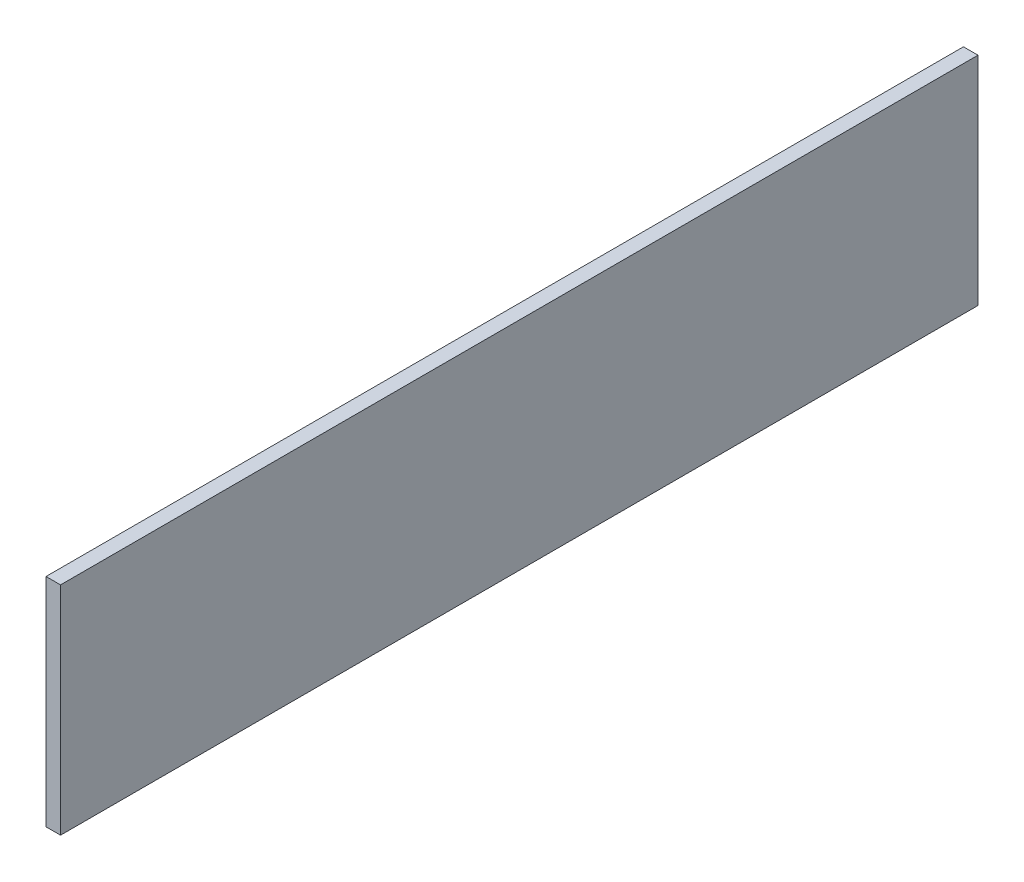
ISO-10303-21;
HEADER;
FILE_DESCRIPTION(('STEP AP214'),'2;1');
FILE_NAME('part.step','',(''),(''),'','','');
FILE_SCHEMA(('AUTOMOTIVE_DESIGN { 1 0 10303 214 1 1 1 1 }'));
ENDSEC;
DATA;
#1=APPLICATION_CONTEXT('core data for automotive mechanical design processes');
#2=APPLICATION_PROTOCOL_DEFINITION('international standard','automotive_design',2000,#1);
#3=PRODUCT_CONTEXT('',#1,'mechanical');
#4=PRODUCT('Part','Part','',(#3));
#5=PRODUCT_RELATED_PRODUCT_CATEGORY('part','',(#4));
#6=PRODUCT_DEFINITION_FORMATION('','',#4);
#7=PRODUCT_DEFINITION_CONTEXT('part definition',#1,'design');
#8=PRODUCT_DEFINITION('design','',#6,#7);
#9=PRODUCT_DEFINITION_SHAPE('','',#8);
#10=(LENGTH_UNIT() NAMED_UNIT(*) SI_UNIT(.MILLI.,.METRE.));
#11=(NAMED_UNIT(*) PLANE_ANGLE_UNIT() SI_UNIT($,.RADIAN.));
#12=(NAMED_UNIT(*) SI_UNIT($,.STERADIAN.) SOLID_ANGLE_UNIT());
#13=UNCERTAINTY_MEASURE_WITH_UNIT(LENGTH_MEASURE(1.E-05),#10,'distance_accuracy_value','');
#14=(GEOMETRIC_REPRESENTATION_CONTEXT(3) GLOBAL_UNCERTAINTY_ASSIGNED_CONTEXT((#13)) GLOBAL_UNIT_ASSIGNED_CONTEXT((#10,
#11,#12)) REPRESENTATION_CONTEXT('',''));
#15=CARTESIAN_POINT('',(0.,0.,0.));
#16=DIRECTION('',(0.,0.,1.));
#17=DIRECTION('',(1.,0.,0.));
#18=AXIS2_PLACEMENT_3D('',#15,#16,#17);
#19=CARTESIAN_POINT('',(1338.,1469.,-757.5));
#20=DIRECTION('',(-1.,0.,0.));
#21=DIRECTION('',(0.,0.,1.));
#22=AXIS2_PLACEMENT_3D('',#19,#20,#21);
#23=PLANE('',#22);
#24=DIRECTION('',(0.,-1.,0.));
#25=VECTOR('',#24,1.);
#26=CARTESIAN_POINT('',(1338.,1469.,0.));
#27=LINE('',#26,#25);
#28=CARTESIAN_POINT('',(1338.,1648.,0.));
#29=VERTEX_POINT('',#28);
#30=CARTESIAN_POINT('',(1338.,1469.,0.));
#31=VERTEX_POINT('',#30);
#32=EDGE_CURVE('E103',#29,#31,#27,.T.);
#33=ORIENTED_EDGE('',*,*,#32,.F.);
#34=DIRECTION('',(0.,0.,1.));
#35=VECTOR('',#34,1.);
#36=CARTESIAN_POINT('',(1338.,1648.,-757.5));
#37=LINE('',#36,#35);
#38=CARTESIAN_POINT('',(1338.,1648.,-757.5));
#39=VERTEX_POINT('',#38);
#40=EDGE_CURVE('E11',#39,#29,#37,.T.);
#41=ORIENTED_EDGE('',*,*,#40,.F.);
#42=DIRECTION('',(0.,-1.,0.));
#43=VECTOR('',#42,1.);
#44=CARTESIAN_POINT('',(1338.,1469.,-757.5));
#45=LINE('',#44,#43);
#46=CARTESIAN_POINT('',(1338.,1469.,-757.5));
#47=VERTEX_POINT('',#46);
#48=EDGE_CURVE('E97',#39,#47,#45,.T.);
#49=ORIENTED_EDGE('',*,*,#48,.T.);
#50=DIRECTION('',(0.,0.,1.));
#51=VECTOR('',#50,1.);
#52=CARTESIAN_POINT('',(1338.,1469.,-757.5));
#53=LINE('',#52,#51);
#54=EDGE_CURVE('E42',#47,#31,#53,.T.);
#55=ORIENTED_EDGE('',*,*,#54,.T.);
#56=EDGE_LOOP('',(#33,#41,#49,#55));
#57=FACE_BOUND('',#56,.T.);
#58=ADVANCED_FACE('F39',(#57),#23,.T.);
#59=CARTESIAN_POINT('',(1338.,1648.,-757.5));
#60=DIRECTION('',(0.,1.,0.));
#61=DIRECTION('',(0.,0.,1.));
#62=AXIS2_PLACEMENT_3D('',#59,#60,#61);
#63=PLANE('',#62);
#64=DIRECTION('',(-1.,0.,0.));
#65=VECTOR('',#64,1.);
#66=CARTESIAN_POINT('',(1338.,1648.,0.));
#67=LINE('',#66,#65);
#68=CARTESIAN_POINT('',(1350.,1648.,0.));
#69=VERTEX_POINT('',#68);
#70=EDGE_CURVE('E99',#69,#29,#67,.T.);
#71=ORIENTED_EDGE('',*,*,#70,.F.);
#72=DIRECTION('',(0.,0.,1.));
#73=VECTOR('',#72,1.);
#74=CARTESIAN_POINT('',(1350.,1648.,-757.5));
#75=LINE('',#74,#73);
#76=CARTESIAN_POINT('',(1350.,1648.,-757.5));
#77=VERTEX_POINT('',#76);
#78=EDGE_CURVE('E48',#77,#69,#75,.T.);
#79=ORIENTED_EDGE('',*,*,#78,.F.);
#80=DIRECTION('',(-1.,0.,0.));
#81=VECTOR('',#80,1.);
#82=CARTESIAN_POINT('',(1338.,1648.,-757.5));
#83=LINE('',#82,#81);
#84=EDGE_CURVE('E94',#77,#39,#83,.T.);
#85=ORIENTED_EDGE('',*,*,#84,.T.);
#86=ORIENTED_EDGE('',*,*,#40,.T.);
#87=EDGE_LOOP('',(#71,#79,#85,#86));
#88=FACE_BOUND('',#87,.T.);
#89=ADVANCED_FACE('F113',(#88),#63,.T.);
#90=CARTESIAN_POINT('',(1350.,1469.,-757.5));
#91=DIRECTION('',(1.,0.,0.));
#92=DIRECTION('',(0.,0.,-1.));
#93=AXIS2_PLACEMENT_3D('',#90,#91,#92);
#94=PLANE('',#93);
#95=DIRECTION('',(0.,1.,0.));
#96=VECTOR('',#95,1.);
#97=CARTESIAN_POINT('',(1350.,1469.,0.));
#98=LINE('',#97,#96);
#99=CARTESIAN_POINT('',(1350.,1469.,0.));
#100=VERTEX_POINT('',#99);
#101=EDGE_CURVE('E89',#100,#69,#98,.T.);
#102=ORIENTED_EDGE('',*,*,#101,.F.);
#103=DIRECTION('',(0.,0.,1.));
#104=VECTOR('',#103,1.);
#105=CARTESIAN_POINT('',(1350.,1469.,-757.5));
#106=LINE('',#105,#104);
#107=CARTESIAN_POINT('',(1350.,1469.,-757.5));
#108=VERTEX_POINT('',#107);
#109=EDGE_CURVE('E84',#108,#100,#106,.T.);
#110=ORIENTED_EDGE('',*,*,#109,.F.);
#111=DIRECTION('',(0.,1.,0.));
#112=VECTOR('',#111,1.);
#113=CARTESIAN_POINT('',(1350.,1469.,-757.5));
#114=LINE('',#113,#112);
#115=EDGE_CURVE('E87',#108,#77,#114,.T.);
#116=ORIENTED_EDGE('',*,*,#115,.T.);
#117=ORIENTED_EDGE('',*,*,#78,.T.);
#118=EDGE_LOOP('',(#102,#110,#116,#117));
#119=FACE_BOUND('',#118,.T.);
#120=ADVANCED_FACE('F86',(#119),#94,.T.);
#121=CARTESIAN_POINT('',(1338.,1469.,-757.5));
#122=DIRECTION('',(0.,-1.,0.));
#123=DIRECTION('',(0.,0.,-1.));
#124=AXIS2_PLACEMENT_3D('',#121,#122,#123);
#125=PLANE('',#124);
#126=DIRECTION('',(1.,0.,0.));
#127=VECTOR('',#126,1.);
#128=CARTESIAN_POINT('',(1338.,1469.,0.));
#129=LINE('',#128,#127);
#130=EDGE_CURVE('E106',#31,#100,#129,.T.);
#131=ORIENTED_EDGE('',*,*,#130,.F.);
#132=ORIENTED_EDGE('',*,*,#54,.F.);
#133=DIRECTION('',(1.,0.,0.));
#134=VECTOR('',#133,1.);
#135=CARTESIAN_POINT('',(1338.,1469.,-757.5));
#136=LINE('',#135,#134);
#137=EDGE_CURVE('E93',#47,#108,#136,.T.);
#138=ORIENTED_EDGE('',*,*,#137,.T.);
#139=ORIENTED_EDGE('',*,*,#109,.T.);
#140=EDGE_LOOP('',(#131,#132,#138,#139));
#141=FACE_BOUND('',#140,.T.);
#142=ADVANCED_FACE('F96',(#141),#125,.T.);
#143=CARTESIAN_POINT('',(0.,0.,-757.5));
#144=DIRECTION('',(0.,0.,-1.));
#145=DIRECTION('',(-1.,0.,0.));
#146=AXIS2_PLACEMENT_3D('',#143,#144,#145);
#147=PLANE('',#146);
#148=ORIENTED_EDGE('',*,*,#48,.F.);
#149=ORIENTED_EDGE('',*,*,#84,.F.);
#150=ORIENTED_EDGE('',*,*,#115,.F.);
#151=ORIENTED_EDGE('',*,*,#137,.F.);
#152=EDGE_LOOP('',(#148,#149,#150,#151));
#153=FACE_BOUND('',#152,.T.);
#154=ADVANCED_FACE('F92',(#153),#147,.T.);
#155=CARTESIAN_POINT('',(0.,0.,0.));
#156=DIRECTION('',(0.,0.,-1.));
#157=DIRECTION('',(-1.,0.,0.));
#158=AXIS2_PLACEMENT_3D('',#155,#156,#157);
#159=PLANE('',#158);
#160=ORIENTED_EDGE('',*,*,#32,.T.);
#161=ORIENTED_EDGE('',*,*,#130,.T.);
#162=ORIENTED_EDGE('',*,*,#101,.T.);
#163=ORIENTED_EDGE('',*,*,#70,.T.);
#164=EDGE_LOOP('',(#160,#161,#162,#163));
#165=FACE_BOUND('',#164,.T.);
#166=ADVANCED_FACE('F112',(#165),#159,.F.);
#167=CLOSED_SHELL('',(#58,#89,#120,#142,#154,#166));
#168=MANIFOLD_SOLID_BREP('B2',#167);
#169=ADVANCED_BREP_SHAPE_REPRESENTATION('',(#18,#168),#14);
#170=SHAPE_DEFINITION_REPRESENTATION(#9,#169);
ENDSEC;
END-ISO-10303-21;
